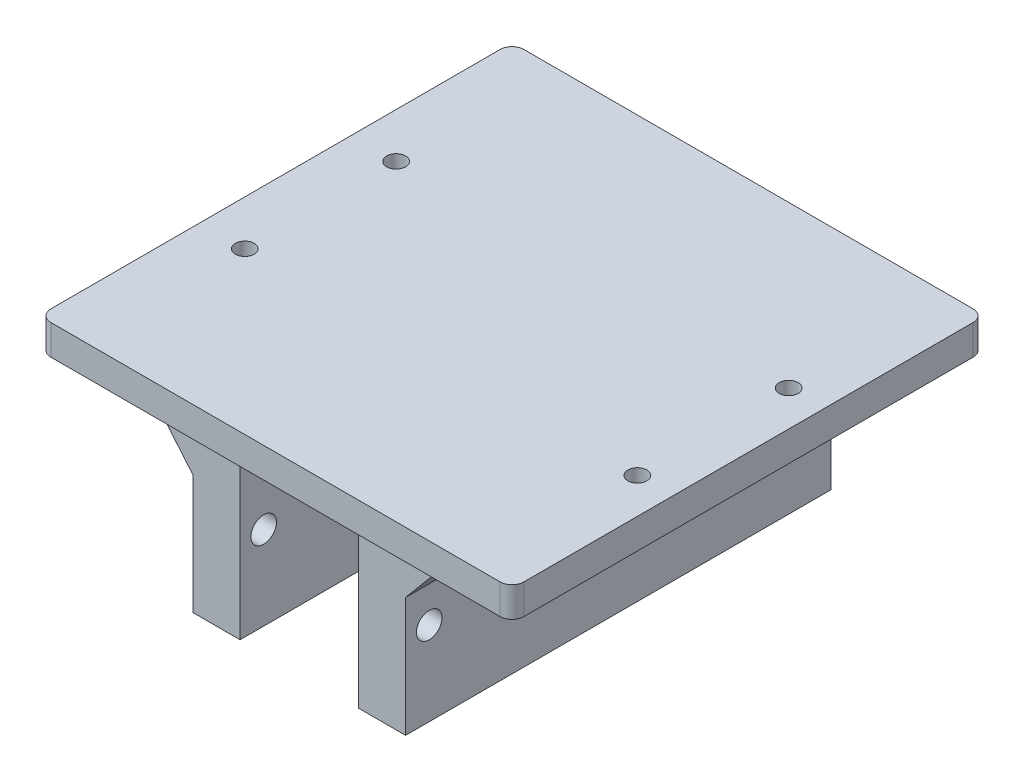
ISO-10303-21;
HEADER;
FILE_DESCRIPTION(('STEP AP214'),'2;1');
FILE_NAME('part.step','',(''),(''),'','','');
FILE_SCHEMA(('AUTOMOTIVE_DESIGN { 1 0 10303 214 1 1 1 1 }'));
ENDSEC;
DATA;
#1=APPLICATION_CONTEXT('core data for automotive mechanical design processes');
#2=APPLICATION_PROTOCOL_DEFINITION('international standard','automotive_design',2000,#1);
#3=PRODUCT_CONTEXT('',#1,'mechanical');
#4=PRODUCT('Part','Part','',(#3));
#5=PRODUCT_RELATED_PRODUCT_CATEGORY('part','',(#4));
#6=PRODUCT_DEFINITION_FORMATION('','',#4);
#7=PRODUCT_DEFINITION_CONTEXT('part definition',#1,'design');
#8=PRODUCT_DEFINITION('design','',#6,#7);
#9=PRODUCT_DEFINITION_SHAPE('','',#8);
#10=(LENGTH_UNIT() NAMED_UNIT(*) SI_UNIT(.MILLI.,.METRE.));
#11=(NAMED_UNIT(*) PLANE_ANGLE_UNIT() SI_UNIT($,.RADIAN.));
#12=(NAMED_UNIT(*) SI_UNIT($,.STERADIAN.) SOLID_ANGLE_UNIT());
#13=UNCERTAINTY_MEASURE_WITH_UNIT(LENGTH_MEASURE(1.E-05),#10,'distance_accuracy_value','');
#14=(GEOMETRIC_REPRESENTATION_CONTEXT(3) GLOBAL_UNCERTAINTY_ASSIGNED_CONTEXT((#13)) GLOBAL_UNIT_ASSIGNED_CONTEXT((#10,
#11,#12)) REPRESENTATION_CONTEXT('',''));
#15=CARTESIAN_POINT('',(0.,0.,0.));
#16=DIRECTION('',(0.,0.,1.));
#17=DIRECTION('',(1.,0.,0.));
#18=AXIS2_PLACEMENT_3D('',#15,#16,#17);
#19=CARTESIAN_POINT('',(72.5,-36.75,-95.));
#20=DIRECTION('',(1.,0.,0.));
#21=DIRECTION('',(0.,0.,-1.));
#22=AXIS2_PLACEMENT_3D('',#19,#20,#21);
#23=PLANE('',#22);
#24=CARTESIAN_POINT('',(72.5,-19.05,-90.));
#25=DIRECTION('',(1.,0.,0.));
#26=DIRECTION('',(0.,0.,-1.));
#27=AXIS2_PLACEMENT_3D('',#24,#25,#26);
#28=CIRCLE('',#27,2.7);
#29=CARTESIAN_POINT('',(72.5,-19.05,-92.7));
#30=VERTEX_POINT('',#29);
#31=EDGE_CURVE('E372',#30,#30,#28,.T.);
#32=ORIENTED_EDGE('',*,*,#31,.F.);
#33=EDGE_LOOP('',(#32));
#34=FACE_BOUND('',#33,.T.);
#35=CARTESIAN_POINT('',(72.5,-19.05,-50.));
#36=DIRECTION('',(1.,0.,0.));
#37=DIRECTION('',(0.,0.,-1.));
#38=AXIS2_PLACEMENT_3D('',#35,#36,#37);
#39=CIRCLE('',#38,2.7);
#40=CARTESIAN_POINT('',(72.5,-19.05,-52.7));
#41=VERTEX_POINT('',#40);
#42=EDGE_CURVE('E351',#41,#41,#39,.T.);
#43=ORIENTED_EDGE('',*,*,#42,.F.);
#44=EDGE_LOOP('',(#43));
#45=FACE_BOUND('',#44,.T.);
#46=CARTESIAN_POINT('',(72.5,-19.05,-10.));
#47=DIRECTION('',(1.,0.,0.));
#48=DIRECTION('',(0.,0.,-1.));
#49=AXIS2_PLACEMENT_3D('',#46,#47,#48);
#50=CIRCLE('',#49,2.7);
#51=CARTESIAN_POINT('',(72.5,-19.05,-12.7));
#52=VERTEX_POINT('',#51);
#53=EDGE_CURVE('E346',#52,#52,#50,.T.);
#54=ORIENTED_EDGE('',*,*,#53,.F.);
#55=EDGE_LOOP('',(#54));
#56=FACE_BOUND('',#55,.T.);
#57=DIRECTION('',(0.,1.,0.));
#58=VECTOR('',#57,1.);
#59=CARTESIAN_POINT('',(72.5,-36.75,-95.));
#60=LINE('',#59,#58);
#61=CARTESIAN_POINT('',(72.5,-36.75,-95.));
#62=VERTEX_POINT('',#61);
#63=CARTESIAN_POINT('',(72.5,-11.4906666467846,-95.));
#64=VERTEX_POINT('',#63);
#65=EDGE_CURVE('E190',#62,#64,#60,.T.);
#66=ORIENTED_EDGE('',*,*,#65,.T.);
#67=DIRECTION('',(0.,0.,1.));
#68=VECTOR('',#67,1.);
#69=CARTESIAN_POINT('',(72.5,-11.4906666467846,-110.));
#70=LINE('',#69,#68);
#71=CARTESIAN_POINT('',(72.5,-11.4906666467846,-5.00000000000002));
#72=VERTEX_POINT('',#71);
#73=EDGE_CURVE('E174',#64,#72,#70,.T.);
#74=ORIENTED_EDGE('',*,*,#73,.T.);
#75=DIRECTION('',(0.,1.,0.));
#76=VECTOR('',#75,1.);
#77=CARTESIAN_POINT('',(72.5,-36.75,-5.00000000000001));
#78=LINE('',#77,#76);
#79=CARTESIAN_POINT('',(72.5,-36.75,-5.00000000000001));
#80=VERTEX_POINT('',#79);
#81=EDGE_CURVE('E201',#80,#72,#78,.T.);
#82=ORIENTED_EDGE('',*,*,#81,.F.);
#83=DIRECTION('',(0.,0.,-1.));
#84=VECTOR('',#83,1.);
#85=CARTESIAN_POINT('',(72.5,-36.75,-95.));
#86=LINE('',#85,#84);
#87=EDGE_CURVE('E198',#80,#62,#86,.T.);
#88=ORIENTED_EDGE('',*,*,#87,.T.);
#89=EDGE_LOOP('',(#66,#74,#82,#88));
#90=FACE_BOUND('',#89,.T.);
#91=ADVANCED_FACE('F45',(#34,#45,#56,#90),#23,.T.);
#92=CARTESIAN_POINT('',(27.5000000000001,-36.75,-5.));
#93=DIRECTION('',(-1.,0.,0.));
#94=DIRECTION('',(0.,0.,1.));
#95=AXIS2_PLACEMENT_3D('',#92,#93,#94);
#96=PLANE('',#95);
#97=CARTESIAN_POINT('',(27.5,-19.05,-90.));
#98=DIRECTION('',(-1.,0.,0.));
#99=DIRECTION('',(0.,0.,1.));
#100=AXIS2_PLACEMENT_3D('',#97,#98,#99);
#101=CIRCLE('',#100,2.7);
#102=CARTESIAN_POINT('',(27.5,-19.05,-87.3));
#103=VERTEX_POINT('',#102);
#104=EDGE_CURVE('E347',#103,#103,#101,.T.);
#105=ORIENTED_EDGE('',*,*,#104,.F.);
#106=EDGE_LOOP('',(#105));
#107=FACE_BOUND('',#106,.T.);
#108=CARTESIAN_POINT('',(27.5,-19.05,-50.));
#109=DIRECTION('',(-1.,0.,0.));
#110=DIRECTION('',(0.,0.,1.));
#111=AXIS2_PLACEMENT_3D('',#108,#109,#110);
#112=CIRCLE('',#111,2.7);
#113=CARTESIAN_POINT('',(27.5,-19.05,-47.3));
#114=VERTEX_POINT('',#113);
#115=EDGE_CURVE('E450',#114,#114,#112,.T.);
#116=ORIENTED_EDGE('',*,*,#115,.F.);
#117=EDGE_LOOP('',(#116));
#118=FACE_BOUND('',#117,.T.);
#119=CARTESIAN_POINT('',(27.5,-19.05,-9.99999999999999));
#120=DIRECTION('',(-1.,0.,0.));
#121=DIRECTION('',(0.,0.,1.));
#122=AXIS2_PLACEMENT_3D('',#119,#120,#121);
#123=CIRCLE('',#122,2.7);
#124=CARTESIAN_POINT('',(27.5,-19.05,-7.29999999999999));
#125=VERTEX_POINT('',#124);
#126=EDGE_CURVE('E195',#125,#125,#123,.T.);
#127=ORIENTED_EDGE('',*,*,#126,.F.);
#128=EDGE_LOOP('',(#127));
#129=FACE_BOUND('',#128,.T.);
#130=DIRECTION('',(0.,1.,0.));
#131=VECTOR('',#130,1.);
#132=CARTESIAN_POINT('',(27.5000000000001,-36.75,-5.));
#133=LINE('',#132,#131);
#134=CARTESIAN_POINT('',(27.5000000000001,-36.75,-5.));
#135=VERTEX_POINT('',#134);
#136=CARTESIAN_POINT('',(27.5000000000001,-11.4906666467846,-5.));
#137=VERTEX_POINT('',#136);
#138=EDGE_CURVE('E395',#135,#137,#133,.T.);
#139=ORIENTED_EDGE('',*,*,#138,.T.);
#140=DIRECTION('',(0.,0.,1.));
#141=VECTOR('',#140,1.);
#142=CARTESIAN_POINT('',(27.5000000000001,-11.4906666467846,-110.));
#143=LINE('',#142,#141);
#144=CARTESIAN_POINT('',(27.5,-11.4906666467846,-95.));
#145=VERTEX_POINT('',#144);
#146=EDGE_CURVE('E428',#145,#137,#143,.T.);
#147=ORIENTED_EDGE('',*,*,#146,.F.);
#148=DIRECTION('',(0.,1.,0.));
#149=VECTOR('',#148,1.);
#150=CARTESIAN_POINT('',(27.5,-36.75,-95.));
#151=LINE('',#150,#149);
#152=CARTESIAN_POINT('',(27.5,-36.75,-95.));
#153=VERTEX_POINT('',#152);
#154=EDGE_CURVE('E242',#153,#145,#151,.T.);
#155=ORIENTED_EDGE('',*,*,#154,.F.);
#156=DIRECTION('',(0.,0.,1.));
#157=VECTOR('',#156,1.);
#158=CARTESIAN_POINT('',(27.5000000000001,-36.75,-5.));
#159=LINE('',#158,#157);
#160=EDGE_CURVE('E379',#153,#135,#159,.T.);
#161=ORIENTED_EDGE('',*,*,#160,.T.);
#162=EDGE_LOOP('',(#139,#147,#155,#161));
#163=FACE_BOUND('',#162,.T.);
#164=ADVANCED_FACE('F459',(#107,#118,#129,#163),#96,.T.);
#165=CARTESIAN_POINT('',(97.5,6.35,-97.5));
#166=DIRECTION('',(0.,-1.,0.));
#167=DIRECTION('',(0.,0.,-1.));
#168=AXIS2_PLACEMENT_3D('',#165,#166,#167);
#169=PLANE('',#168);
#170=CARTESIAN_POINT('',(97.5,6.35,-97.5));
#171=DIRECTION('',(0.,1.,0.));
#172=DIRECTION('',(0.,0.,-1.));
#173=AXIS2_PLACEMENT_3D('',#170,#171,#172);
#174=CIRCLE('',#173,2.5);
#175=CARTESIAN_POINT('',(100.,6.35,-97.5));
#176=VERTEX_POINT('',#175);
#177=CARTESIAN_POINT('',(97.5,6.35,-100.));
#178=VERTEX_POINT('',#177);
#179=EDGE_CURVE('E267',#176,#178,#174,.T.);
#180=ORIENTED_EDGE('',*,*,#179,.T.);
#181=DIRECTION('',(-1.,0.,0.));
#182=VECTOR('',#181,1.);
#183=CARTESIAN_POINT('',(2.5,6.35,-100.));
#184=LINE('',#183,#182);
#185=CARTESIAN_POINT('',(2.5,6.35,-100.));
#186=VERTEX_POINT('',#185);
#187=EDGE_CURVE('E271',#178,#186,#184,.T.);
#188=ORIENTED_EDGE('',*,*,#187,.T.);
#189=CARTESIAN_POINT('',(2.5,6.35,-97.5));
#190=DIRECTION('',(0.,1.,0.));
#191=DIRECTION('',(0.,0.,-1.));
#192=AXIS2_PLACEMENT_3D('',#189,#190,#191);
#193=CIRCLE('',#192,2.5);
#194=CARTESIAN_POINT('',(0.,6.35,-97.5));
#195=VERTEX_POINT('',#194);
#196=EDGE_CURVE('E275',#186,#195,#193,.T.);
#197=ORIENTED_EDGE('',*,*,#196,.T.);
#198=DIRECTION('',(0.,0.,1.));
#199=VECTOR('',#198,1.);
#200=CARTESIAN_POINT('',(0.,6.35,-2.50000000000002));
#201=LINE('',#200,#199);
#202=CARTESIAN_POINT('',(0.,6.35,-2.50000000000002));
#203=VERTEX_POINT('',#202);
#204=EDGE_CURVE('E278',#195,#203,#201,.T.);
#205=ORIENTED_EDGE('',*,*,#204,.T.);
#206=CARTESIAN_POINT('',(2.5,6.35,-2.5));
#207=DIRECTION('',(0.,1.,0.));
#208=DIRECTION('',(0.,0.,-1.));
#209=AXIS2_PLACEMENT_3D('',#206,#207,#208);
#210=CIRCLE('',#209,2.5);
#211=CARTESIAN_POINT('',(2.50000000000002,6.35,0.));
#212=VERTEX_POINT('',#211);
#213=EDGE_CURVE('E281',#203,#212,#210,.T.);
#214=ORIENTED_EDGE('',*,*,#213,.T.);
#215=DIRECTION('',(1.,0.,0.));
#216=VECTOR('',#215,1.);
#217=CARTESIAN_POINT('',(2.50000000000002,6.35,0.));
#218=LINE('',#217,#216);
#219=CARTESIAN_POINT('',(97.5,6.35,0.));
#220=VERTEX_POINT('',#219);
#221=EDGE_CURVE('E284',#212,#220,#218,.T.);
#222=ORIENTED_EDGE('',*,*,#221,.T.);
#223=CARTESIAN_POINT('',(97.5,6.35,-2.5));
#224=DIRECTION('',(0.,1.,0.));
#225=DIRECTION('',(0.,0.,1.));
#226=AXIS2_PLACEMENT_3D('',#223,#224,#225);
#227=CIRCLE('',#226,2.5);
#228=CARTESIAN_POINT('',(100.,6.35,-2.5));
#229=VERTEX_POINT('',#228);
#230=EDGE_CURVE('E287',#220,#229,#227,.T.);
#231=ORIENTED_EDGE('',*,*,#230,.T.);
#232=DIRECTION('',(0.,0.,-1.));
#233=VECTOR('',#232,1.);
#234=CARTESIAN_POINT('',(100.,6.35,-2.5));
#235=LINE('',#234,#233);
#236=EDGE_CURVE('E290',#229,#176,#235,.T.);
#237=ORIENTED_EDGE('',*,*,#236,.T.);
#238=EDGE_LOOP('',(#180,#188,#197,#205,#214,#222,#231,#237));
#239=FACE_BOUND('',#238,.T.);
#240=CARTESIAN_POINT('',(9.5,6.35,-34.));
#241=DIRECTION('',(0.,1.,0.));
#242=DIRECTION('',(0.,0.,1.));
#243=AXIS2_PLACEMENT_3D('',#240,#241,#242);
#244=CIRCLE('',#243,2.);
#245=CARTESIAN_POINT('',(9.5,6.35,-32.));
#246=VERTEX_POINT('',#245);
#247=EDGE_CURVE('E259',#246,#246,#244,.T.);
#248=ORIENTED_EDGE('',*,*,#247,.F.);
#249=EDGE_LOOP('',(#248));
#250=FACE_BOUND('',#249,.T.);
#251=CARTESIAN_POINT('',(9.5,6.35,-66.));
#252=DIRECTION('',(0.,1.,0.));
#253=DIRECTION('',(0.,0.,1.));
#254=AXIS2_PLACEMENT_3D('',#251,#252,#253);
#255=CIRCLE('',#254,2.);
#256=CARTESIAN_POINT('',(9.5,6.35,-64.));
#257=VERTEX_POINT('',#256);
#258=EDGE_CURVE('E251',#257,#257,#255,.T.);
#259=ORIENTED_EDGE('',*,*,#258,.F.);
#260=EDGE_LOOP('',(#259));
#261=FACE_BOUND('',#260,.T.);
#262=CARTESIAN_POINT('',(92.5,6.35,-66.));
#263=DIRECTION('',(0.,1.,0.));
#264=DIRECTION('',(0.,0.,1.));
#265=AXIS2_PLACEMENT_3D('',#262,#263,#264);
#266=CIRCLE('',#265,2.);
#267=CARTESIAN_POINT('',(92.5,6.35,-64.));
#268=VERTEX_POINT('',#267);
#269=EDGE_CURVE('E243',#268,#268,#266,.T.);
#270=ORIENTED_EDGE('',*,*,#269,.F.);
#271=EDGE_LOOP('',(#270));
#272=FACE_BOUND('',#271,.T.);
#273=CARTESIAN_POINT('',(92.5,6.35,-34.));
#274=DIRECTION('',(0.,1.,0.));
#275=DIRECTION('',(0.,0.,1.));
#276=AXIS2_PLACEMENT_3D('',#273,#274,#275);
#277=CIRCLE('',#276,2.);
#278=CARTESIAN_POINT('',(92.5,6.35,-32.));
#279=VERTEX_POINT('',#278);
#280=EDGE_CURVE('E233',#279,#279,#277,.T.);
#281=ORIENTED_EDGE('',*,*,#280,.F.);
#282=EDGE_LOOP('',(#281));
#283=FACE_BOUND('',#282,.T.);
#284=ADVANCED_FACE('F462',(#239,#250,#261,#272,#283),#169,.F.);
#285=CARTESIAN_POINT('',(97.5,0.,-97.5));
#286=DIRECTION('',(0.,-1.,0.));
#287=DIRECTION('',(0.,0.,-1.));
#288=AXIS2_PLACEMENT_3D('',#285,#286,#287);
#289=PLANE('',#288);
#290=DIRECTION('',(1.,0.,0.));
#291=VECTOR('',#290,1.);
#292=CARTESIAN_POINT('',(62.5,0.,-5.00000000000001));
#293=LINE('',#292,#291);
#294=CARTESIAN_POINT('',(62.5,0.,-5.00000000000001));
#295=VERTEX_POINT('',#294);
#296=CARTESIAN_POINT('',(82.1418141452982,0.,-5.00000000000002));
#297=VERTEX_POINT('',#296);
#298=EDGE_CURVE('E214',#295,#297,#293,.T.);
#299=ORIENTED_EDGE('',*,*,#298,.T.);
#300=DIRECTION('',(0.,0.,1.));
#301=VECTOR('',#300,1.);
#302=CARTESIAN_POINT('',(82.1418141452982,0.,-110.));
#303=LINE('',#302,#301);
#304=CARTESIAN_POINT('',(82.1418141452982,0.,-95.));
#305=VERTEX_POINT('',#304);
#306=EDGE_CURVE('E426',#305,#297,#303,.T.);
#307=ORIENTED_EDGE('',*,*,#306,.F.);
#308=DIRECTION('',(-1.,0.,0.));
#309=VECTOR('',#308,1.);
#310=CARTESIAN_POINT('',(62.5,0.,-95.));
#311=LINE('',#310,#309);
#312=CARTESIAN_POINT('',(62.5,0.,-95.));
#313=VERTEX_POINT('',#312);
#314=EDGE_CURVE('E193',#305,#313,#311,.T.);
#315=ORIENTED_EDGE('',*,*,#314,.T.);
#316=DIRECTION('',(0.,0.,1.));
#317=VECTOR('',#316,1.);
#318=CARTESIAN_POINT('',(62.5,0.,-95.));
#319=LINE('',#318,#317);
#320=EDGE_CURVE('E218',#313,#295,#319,.T.);
#321=ORIENTED_EDGE('',*,*,#320,.T.);
#322=EDGE_LOOP('',(#299,#307,#315,#321));
#323=FACE_BOUND('',#322,.T.);
#324=DIRECTION('',(0.,0.,1.));
#325=VECTOR('',#324,1.);
#326=CARTESIAN_POINT('',(17.8581858547019,0.,-110.));
#327=LINE('',#326,#325);
#328=CARTESIAN_POINT('',(17.8581858547019,0.,-95.));
#329=VERTEX_POINT('',#328);
#330=CARTESIAN_POINT('',(17.8581858547019,0.,-5.));
#331=VERTEX_POINT('',#330);
#332=EDGE_CURVE('E437',#329,#331,#327,.T.);
#333=ORIENTED_EDGE('',*,*,#332,.T.);
#334=DIRECTION('',(1.,0.,0.));
#335=VECTOR('',#334,1.);
#336=CARTESIAN_POINT('',(27.5000000000001,0.,-5.));
#337=LINE('',#336,#335);
#338=CARTESIAN_POINT('',(37.5,0.,-5.00000000000001));
#339=VERTEX_POINT('',#338);
#340=EDGE_CURVE('E63',#331,#339,#337,.T.);
#341=ORIENTED_EDGE('',*,*,#340,.T.);
#342=DIRECTION('',(0.,0.,-1.));
#343=VECTOR('',#342,1.);
#344=CARTESIAN_POINT('',(37.5,0.,-5.00000000000001));
#345=LINE('',#344,#343);
#346=CARTESIAN_POINT('',(37.5,0.,-95.));
#347=VERTEX_POINT('',#346);
#348=EDGE_CURVE('E398',#339,#347,#345,.T.);
#349=ORIENTED_EDGE('',*,*,#348,.T.);
#350=DIRECTION('',(-1.,0.,0.));
#351=VECTOR('',#350,1.);
#352=CARTESIAN_POINT('',(27.5,0.,-95.));
#353=LINE('',#352,#351);
#354=EDGE_CURVE('E70',#347,#329,#353,.T.);
#355=ORIENTED_EDGE('',*,*,#354,.T.);
#356=EDGE_LOOP('',(#333,#341,#349,#355));
#357=FACE_BOUND('',#356,.T.);
#358=CARTESIAN_POINT('',(92.5,0.,-66.));
#359=DIRECTION('',(0.,1.,0.));
#360=DIRECTION('',(0.,0.,1.));
#361=AXIS2_PLACEMENT_3D('',#358,#359,#360);
#362=CIRCLE('',#361,2.);
#363=CARTESIAN_POINT('',(92.5,0.,-64.));
#364=VERTEX_POINT('',#363);
#365=EDGE_CURVE('E237',#364,#364,#362,.T.);
#366=ORIENTED_EDGE('',*,*,#365,.T.);
#367=EDGE_LOOP('',(#366));
#368=FACE_BOUND('',#367,.T.);
#369=CARTESIAN_POINT('',(9.5,0.,-34.));
#370=DIRECTION('',(0.,1.,0.));
#371=DIRECTION('',(0.,0.,1.));
#372=AXIS2_PLACEMENT_3D('',#369,#370,#371);
#373=CIRCLE('',#372,2.);
#374=CARTESIAN_POINT('',(9.5,0.,-32.));
#375=VERTEX_POINT('',#374);
#376=EDGE_CURVE('E255',#375,#375,#373,.T.);
#377=ORIENTED_EDGE('',*,*,#376,.T.);
#378=EDGE_LOOP('',(#377));
#379=FACE_BOUND('',#378,.T.);
#380=CARTESIAN_POINT('',(97.5,0.,-97.5));
#381=DIRECTION('',(0.,1.,0.));
#382=DIRECTION('',(0.,0.,-1.));
#383=AXIS2_PLACEMENT_3D('',#380,#381,#382);
#384=CIRCLE('',#383,2.5);
#385=CARTESIAN_POINT('',(100.,0.,-97.5));
#386=VERTEX_POINT('',#385);
#387=CARTESIAN_POINT('',(97.5,0.,-100.));
#388=VERTEX_POINT('',#387);
#389=EDGE_CURVE('E263',#386,#388,#384,.T.);
#390=ORIENTED_EDGE('',*,*,#389,.F.);
#391=DIRECTION('',(0.,0.,-1.));
#392=VECTOR('',#391,1.);
#393=CARTESIAN_POINT('',(100.,0.,-2.5));
#394=LINE('',#393,#392);
#395=CARTESIAN_POINT('',(100.,0.,-2.5));
#396=VERTEX_POINT('',#395);
#397=EDGE_CURVE('E272',#396,#386,#394,.T.);
#398=ORIENTED_EDGE('',*,*,#397,.F.);
#399=CARTESIAN_POINT('',(97.5,0.,-2.5));
#400=DIRECTION('',(0.,1.,0.));
#401=DIRECTION('',(0.,0.,1.));
#402=AXIS2_PLACEMENT_3D('',#399,#400,#401);
#403=CIRCLE('',#402,2.5);
#404=CARTESIAN_POINT('',(97.5,0.,0.));
#405=VERTEX_POINT('',#404);
#406=EDGE_CURVE('E312',#405,#396,#403,.T.);
#407=ORIENTED_EDGE('',*,*,#406,.F.);
#408=DIRECTION('',(1.,0.,0.));
#409=VECTOR('',#408,1.);
#410=CARTESIAN_POINT('',(2.50000000000002,0.,0.));
#411=LINE('',#410,#409);
#412=CARTESIAN_POINT('',(2.50000000000002,0.,0.));
#413=VERTEX_POINT('',#412);
#414=EDGE_CURVE('E309',#413,#405,#411,.T.);
#415=ORIENTED_EDGE('',*,*,#414,.F.);
#416=CARTESIAN_POINT('',(2.5,0.,-2.5));
#417=DIRECTION('',(0.,1.,0.));
#418=DIRECTION('',(0.,0.,-1.));
#419=AXIS2_PLACEMENT_3D('',#416,#417,#418);
#420=CIRCLE('',#419,2.5);
#421=CARTESIAN_POINT('',(0.,0.,-2.50000000000002));
#422=VERTEX_POINT('',#421);
#423=EDGE_CURVE('E306',#422,#413,#420,.T.);
#424=ORIENTED_EDGE('',*,*,#423,.F.);
#425=DIRECTION('',(0.,0.,1.));
#426=VECTOR('',#425,1.);
#427=CARTESIAN_POINT('',(0.,0.,-2.50000000000002));
#428=LINE('',#427,#426);
#429=CARTESIAN_POINT('',(0.,0.,-97.5));
#430=VERTEX_POINT('',#429);
#431=EDGE_CURVE('E303',#430,#422,#428,.T.);
#432=ORIENTED_EDGE('',*,*,#431,.F.);
#433=CARTESIAN_POINT('',(2.5,0.,-97.5));
#434=DIRECTION('',(0.,1.,0.));
#435=DIRECTION('',(0.,0.,-1.));
#436=AXIS2_PLACEMENT_3D('',#433,#434,#435);
#437=CIRCLE('',#436,2.5);
#438=CARTESIAN_POINT('',(2.5,0.,-100.));
#439=VERTEX_POINT('',#438);
#440=EDGE_CURVE('E300',#439,#430,#437,.T.);
#441=ORIENTED_EDGE('',*,*,#440,.F.);
#442=DIRECTION('',(-1.,0.,0.));
#443=VECTOR('',#442,1.);
#444=CARTESIAN_POINT('',(2.5,0.,-100.));
#445=LINE('',#444,#443);
#446=EDGE_CURVE('E297',#388,#439,#445,.T.);
#447=ORIENTED_EDGE('',*,*,#446,.F.);
#448=EDGE_LOOP('',(#390,#398,#407,#415,#424,#432,#441,#447));
#449=FACE_BOUND('',#448,.T.);
#450=CARTESIAN_POINT('',(9.5,0.,-66.));
#451=DIRECTION('',(0.,1.,0.));
#452=DIRECTION('',(0.,0.,1.));
#453=AXIS2_PLACEMENT_3D('',#450,#451,#452);
#454=CIRCLE('',#453,2.);
#455=CARTESIAN_POINT('',(9.5,0.,-64.));
#456=VERTEX_POINT('',#455);
#457=EDGE_CURVE('E247',#456,#456,#454,.T.);
#458=ORIENTED_EDGE('',*,*,#457,.T.);
#459=EDGE_LOOP('',(#458));
#460=FACE_BOUND('',#459,.T.);
#461=CARTESIAN_POINT('',(92.5,0.,-34.));
#462=DIRECTION('',(0.,1.,0.));
#463=DIRECTION('',(0.,0.,1.));
#464=AXIS2_PLACEMENT_3D('',#461,#462,#463);
#465=CIRCLE('',#464,2.);
#466=CARTESIAN_POINT('',(92.5,0.,-32.));
#467=VERTEX_POINT('',#466);
#468=EDGE_CURVE('E238',#467,#467,#465,.T.);
#469=ORIENTED_EDGE('',*,*,#468,.T.);
#470=EDGE_LOOP('',(#469));
#471=FACE_BOUND('',#470,.T.);
#472=ADVANCED_FACE('F425',(#323,#357,#368,#379,#449,#460,#471),#289,.T.);
#473=CARTESIAN_POINT('',(97.5,6.35,-97.5));
#474=DIRECTION('',(0.,-1.,0.));
#475=DIRECTION('',(0.,0.,-1.));
#476=AXIS2_PLACEMENT_3D('',#473,#474,#475);
#477=CYLINDRICAL_SURFACE('',#476,2.5);
#478=ORIENTED_EDGE('',*,*,#389,.T.);
#479=DIRECTION('',(0.,-1.,0.));
#480=VECTOR('',#479,1.);
#481=CARTESIAN_POINT('',(97.5,6.35,-100.));
#482=LINE('',#481,#480);
#483=EDGE_CURVE('E11',#178,#388,#482,.T.);
#484=ORIENTED_EDGE('',*,*,#483,.F.);
#485=ORIENTED_EDGE('',*,*,#179,.F.);
#486=DIRECTION('',(0.,-1.,0.));
#487=VECTOR('',#486,1.);
#488=CARTESIAN_POINT('',(100.,6.35,-97.5));
#489=LINE('',#488,#487);
#490=EDGE_CURVE('E293',#176,#386,#489,.T.);
#491=ORIENTED_EDGE('',*,*,#490,.T.);
#492=EDGE_LOOP('',(#478,#484,#485,#491));
#493=FACE_BOUND('',#492,.T.);
#494=ADVANCED_FACE('F47',(#493),#477,.T.);
#495=CARTESIAN_POINT('',(2.5,6.35,-100.));
#496=DIRECTION('',(0.,0.,1.));
#497=DIRECTION('',(1.,0.,0.));
#498=AXIS2_PLACEMENT_3D('',#495,#496,#497);
#499=PLANE('',#498);
#500=ORIENTED_EDGE('',*,*,#446,.T.);
#501=DIRECTION('',(0.,-1.,0.));
#502=VECTOR('',#501,1.);
#503=CARTESIAN_POINT('',(2.5,6.35,-100.));
#504=LINE('',#503,#502);
#505=EDGE_CURVE('E55',#186,#439,#504,.T.);
#506=ORIENTED_EDGE('',*,*,#505,.F.);
#507=ORIENTED_EDGE('',*,*,#187,.F.);
#508=ORIENTED_EDGE('',*,*,#483,.T.);
#509=EDGE_LOOP('',(#500,#506,#507,#508));
#510=FACE_BOUND('',#509,.T.);
#511=ADVANCED_FACE('F546',(#510),#499,.F.);
#512=CARTESIAN_POINT('',(2.5,6.35,-97.5));
#513=DIRECTION('',(0.,-1.,0.));
#514=DIRECTION('',(0.,0.,-1.));
#515=AXIS2_PLACEMENT_3D('',#512,#513,#514);
#516=CYLINDRICAL_SURFACE('',#515,2.5);
#517=ORIENTED_EDGE('',*,*,#440,.T.);
#518=DIRECTION('',(0.,-1.,0.));
#519=VECTOR('',#518,1.);
#520=CARTESIAN_POINT('',(0.,6.35,-97.5));
#521=LINE('',#520,#519);
#522=EDGE_CURVE('E336',#195,#430,#521,.T.);
#523=ORIENTED_EDGE('',*,*,#522,.F.);
#524=ORIENTED_EDGE('',*,*,#196,.F.);
#525=ORIENTED_EDGE('',*,*,#505,.T.);
#526=EDGE_LOOP('',(#517,#523,#524,#525));
#527=FACE_BOUND('',#526,.T.);
#528=ADVANCED_FACE('F543',(#527),#516,.T.);
#529=CARTESIAN_POINT('',(0.,6.35,-2.50000000000002));
#530=DIRECTION('',(1.,0.,0.));
#531=DIRECTION('',(0.,0.,-1.));
#532=AXIS2_PLACEMENT_3D('',#529,#530,#531);
#533=PLANE('',#532);
#534=ORIENTED_EDGE('',*,*,#431,.T.);
#535=DIRECTION('',(0.,-1.,0.));
#536=VECTOR('',#535,1.);
#537=CARTESIAN_POINT('',(0.,6.35,-2.50000000000002));
#538=LINE('',#537,#536);
#539=EDGE_CURVE('E332',#203,#422,#538,.T.);
#540=ORIENTED_EDGE('',*,*,#539,.F.);
#541=ORIENTED_EDGE('',*,*,#204,.F.);
#542=ORIENTED_EDGE('',*,*,#522,.T.);
#543=EDGE_LOOP('',(#534,#540,#541,#542));
#544=FACE_BOUND('',#543,.T.);
#545=ADVANCED_FACE('F539',(#544),#533,.F.);
#546=CARTESIAN_POINT('',(2.5,6.35,-2.5));
#547=DIRECTION('',(0.,-1.,0.));
#548=DIRECTION('',(0.,0.,-1.));
#549=AXIS2_PLACEMENT_3D('',#546,#547,#548);
#550=CYLINDRICAL_SURFACE('',#549,2.5);
#551=ORIENTED_EDGE('',*,*,#423,.T.);
#552=DIRECTION('',(0.,-1.,0.));
#553=VECTOR('',#552,1.);
#554=CARTESIAN_POINT('',(2.50000000000002,6.35,0.));
#555=LINE('',#554,#553);
#556=EDGE_CURVE('E328',#212,#413,#555,.T.);
#557=ORIENTED_EDGE('',*,*,#556,.F.);
#558=ORIENTED_EDGE('',*,*,#213,.F.);
#559=ORIENTED_EDGE('',*,*,#539,.T.);
#560=EDGE_LOOP('',(#551,#557,#558,#559));
#561=FACE_BOUND('',#560,.T.);
#562=ADVANCED_FACE('F535',(#561),#550,.T.);
#563=CARTESIAN_POINT('',(2.50000000000002,6.35,0.));
#564=DIRECTION('',(0.,0.,-1.));
#565=DIRECTION('',(-1.,0.,0.));
#566=AXIS2_PLACEMENT_3D('',#563,#564,#565);
#567=PLANE('',#566);
#568=ORIENTED_EDGE('',*,*,#414,.T.);
#569=DIRECTION('',(0.,-1.,0.));
#570=VECTOR('',#569,1.);
#571=CARTESIAN_POINT('',(97.5,6.35,0.));
#572=LINE('',#571,#570);
#573=EDGE_CURVE('E324',#220,#405,#572,.T.);
#574=ORIENTED_EDGE('',*,*,#573,.F.);
#575=ORIENTED_EDGE('',*,*,#221,.F.);
#576=ORIENTED_EDGE('',*,*,#556,.T.);
#577=EDGE_LOOP('',(#568,#574,#575,#576));
#578=FACE_BOUND('',#577,.T.);
#579=ADVANCED_FACE('F531',(#578),#567,.F.);
#580=CARTESIAN_POINT('',(97.5,6.35,-2.5));
#581=DIRECTION('',(0.,-1.,0.));
#582=DIRECTION('',(0.,0.,-1.));
#583=AXIS2_PLACEMENT_3D('',#580,#581,#582);
#584=CYLINDRICAL_SURFACE('',#583,2.5);
#585=ORIENTED_EDGE('',*,*,#406,.T.);
#586=DIRECTION('',(0.,-1.,0.));
#587=VECTOR('',#586,1.);
#588=CARTESIAN_POINT('',(100.,6.35,-2.5));
#589=LINE('',#588,#587);
#590=EDGE_CURVE('E320',#229,#396,#589,.T.);
#591=ORIENTED_EDGE('',*,*,#590,.F.);
#592=ORIENTED_EDGE('',*,*,#230,.F.);
#593=ORIENTED_EDGE('',*,*,#573,.T.);
#594=EDGE_LOOP('',(#585,#591,#592,#593));
#595=FACE_BOUND('',#594,.T.);
#596=ADVANCED_FACE('F527',(#595),#584,.T.);
#597=CARTESIAN_POINT('',(100.,6.35,-2.5));
#598=DIRECTION('',(-1.,0.,0.));
#599=DIRECTION('',(0.,0.,1.));
#600=AXIS2_PLACEMENT_3D('',#597,#598,#599);
#601=PLANE('',#600);
#602=ORIENTED_EDGE('',*,*,#397,.T.);
#603=ORIENTED_EDGE('',*,*,#490,.F.);
#604=ORIENTED_EDGE('',*,*,#236,.F.);
#605=ORIENTED_EDGE('',*,*,#590,.T.);
#606=EDGE_LOOP('',(#602,#603,#604,#605));
#607=FACE_BOUND('',#606,.T.);
#608=ADVANCED_FACE('F518',(#607),#601,.F.);
#609=CARTESIAN_POINT('',(9.5,6.35,-34.));
#610=DIRECTION('',(0.,-1.,0.));
#611=DIRECTION('',(0.,0.,-1.));
#612=AXIS2_PLACEMENT_3D('',#609,#610,#611);
#613=CYLINDRICAL_SURFACE('',#612,2.);
#614=ORIENTED_EDGE('',*,*,#247,.T.);
#615=EDGE_LOOP('',(#614));
#616=FACE_BOUND('',#615,.T.);
#617=ORIENTED_EDGE('',*,*,#376,.F.);
#618=EDGE_LOOP('',(#617));
#619=FACE_BOUND('',#618,.T.);
#620=ADVANCED_FACE('F514',(#616,#619),#613,.F.);
#621=CARTESIAN_POINT('',(9.5,6.35,-66.));
#622=DIRECTION('',(0.,-1.,0.));
#623=DIRECTION('',(0.,0.,-1.));
#624=AXIS2_PLACEMENT_3D('',#621,#622,#623);
#625=CYLINDRICAL_SURFACE('',#624,2.);
#626=ORIENTED_EDGE('',*,*,#258,.T.);
#627=EDGE_LOOP('',(#626));
#628=FACE_BOUND('',#627,.T.);
#629=ORIENTED_EDGE('',*,*,#457,.F.);
#630=EDGE_LOOP('',(#629));
#631=FACE_BOUND('',#630,.T.);
#632=ADVANCED_FACE('F510',(#628,#631),#625,.F.);
#633=CARTESIAN_POINT('',(92.5,6.35,-66.));
#634=DIRECTION('',(0.,-1.,0.));
#635=DIRECTION('',(0.,0.,-1.));
#636=AXIS2_PLACEMENT_3D('',#633,#634,#635);
#637=CYLINDRICAL_SURFACE('',#636,2.);
#638=ORIENTED_EDGE('',*,*,#269,.T.);
#639=EDGE_LOOP('',(#638));
#640=FACE_BOUND('',#639,.T.);
#641=ORIENTED_EDGE('',*,*,#365,.F.);
#642=EDGE_LOOP('',(#641));
#643=FACE_BOUND('',#642,.T.);
#644=ADVANCED_FACE('F506',(#640,#643),#637,.F.);
#645=CARTESIAN_POINT('',(92.5,6.35,-34.));
#646=DIRECTION('',(0.,-1.,0.));
#647=DIRECTION('',(0.,0.,-1.));
#648=AXIS2_PLACEMENT_3D('',#645,#646,#647);
#649=CYLINDRICAL_SURFACE('',#648,2.);
#650=ORIENTED_EDGE('',*,*,#280,.T.);
#651=EDGE_LOOP('',(#650));
#652=FACE_BOUND('',#651,.T.);
#653=ORIENTED_EDGE('',*,*,#468,.F.);
#654=EDGE_LOOP('',(#653));
#655=FACE_BOUND('',#654,.T.);
#656=ADVANCED_FACE('F503',(#652,#655),#649,.F.);
#657=CARTESIAN_POINT('',(62.5,-36.75,-95.));
#658=DIRECTION('',(-1.,0.,0.));
#659=DIRECTION('',(0.,0.,1.));
#660=AXIS2_PLACEMENT_3D('',#657,#658,#659);
#661=PLANE('',#660);
#662=CARTESIAN_POINT('',(62.5,-19.05,-90.));
#663=DIRECTION('',(-1.,0.,0.));
#664=DIRECTION('',(0.,0.,1.));
#665=AXIS2_PLACEMENT_3D('',#662,#663,#664);
#666=CIRCLE('',#665,2.7);
#667=CARTESIAN_POINT('',(62.5,-19.05,-87.3));
#668=VERTEX_POINT('',#667);
#669=EDGE_CURVE('E208',#668,#668,#666,.T.);
#670=ORIENTED_EDGE('',*,*,#669,.F.);
#671=EDGE_LOOP('',(#670));
#672=FACE_BOUND('',#671,.T.);
#673=CARTESIAN_POINT('',(62.5,-19.05,-50.));
#674=DIRECTION('',(-1.,0.,0.));
#675=DIRECTION('',(0.,0.,1.));
#676=AXIS2_PLACEMENT_3D('',#673,#674,#675);
#677=CIRCLE('',#676,2.7);
#678=CARTESIAN_POINT('',(62.5,-19.05,-47.3));
#679=VERTEX_POINT('',#678);
#680=EDGE_CURVE('E358',#679,#679,#677,.T.);
#681=ORIENTED_EDGE('',*,*,#680,.F.);
#682=EDGE_LOOP('',(#681));
#683=FACE_BOUND('',#682,.T.);
#684=CARTESIAN_POINT('',(62.5,-19.05,-10.));
#685=DIRECTION('',(-1.,0.,0.));
#686=DIRECTION('',(0.,0.,1.));
#687=AXIS2_PLACEMENT_3D('',#684,#685,#686);
#688=CIRCLE('',#687,2.7);
#689=CARTESIAN_POINT('',(62.5,-19.05,-7.3));
#690=VERTEX_POINT('',#689);
#691=EDGE_CURVE('E352',#690,#690,#688,.T.);
#692=ORIENTED_EDGE('',*,*,#691,.F.);
#693=EDGE_LOOP('',(#692));
#694=FACE_BOUND('',#693,.T.);
#695=ORIENTED_EDGE('',*,*,#320,.F.);
#696=DIRECTION('',(0.,1.,0.));
#697=VECTOR('',#696,1.);
#698=CARTESIAN_POINT('',(62.5,-36.75,-95.));
#699=LINE('',#698,#697);
#700=CARTESIAN_POINT('',(62.5,-36.75,-95.));
#701=VERTEX_POINT('',#700);
#702=EDGE_CURVE('E202',#701,#313,#699,.T.);
#703=ORIENTED_EDGE('',*,*,#702,.F.);
#704=DIRECTION('',(0.,0.,1.));
#705=VECTOR('',#704,1.);
#706=CARTESIAN_POINT('',(62.5,-36.75,-95.));
#707=LINE('',#706,#705);
#708=CARTESIAN_POINT('',(62.5,-36.75,-5.00000000000001));
#709=VERTEX_POINT('',#708);
#710=EDGE_CURVE('E215',#701,#709,#707,.T.);
#711=ORIENTED_EDGE('',*,*,#710,.T.);
#712=DIRECTION('',(0.,1.,0.));
#713=VECTOR('',#712,1.);
#714=CARTESIAN_POINT('',(62.5,-36.75,-5.00000000000001));
#715=LINE('',#714,#713);
#716=EDGE_CURVE('E206',#709,#295,#715,.T.);
#717=ORIENTED_EDGE('',*,*,#716,.T.);
#718=EDGE_LOOP('',(#695,#703,#711,#717));
#719=FACE_BOUND('',#718,.T.);
#720=ADVANCED_FACE('F419',(#672,#683,#694,#719),#661,.T.);
#721=CARTESIAN_POINT('',(62.5,-36.75,-95.));
#722=DIRECTION('',(0.,0.,-1.));
#723=DIRECTION('',(-1.,0.,0.));
#724=AXIS2_PLACEMENT_3D('',#721,#722,#723);
#725=PLANE('',#724);
#726=ORIENTED_EDGE('',*,*,#314,.F.);
#727=DIRECTION('',(-0.642787609686544,-0.766044443118975,0.));
#728=VECTOR('',#727,1.);
#729=CARTESIAN_POINT('',(41.4692903364225,-48.4716263691005,-95.));
#730=LINE('',#729,#728);
#731=EDGE_CURVE('E178',#305,#64,#730,.T.);
#732=ORIENTED_EDGE('',*,*,#731,.T.);
#733=ORIENTED_EDGE('',*,*,#65,.F.);
#734=DIRECTION('',(-1.,0.,0.));
#735=VECTOR('',#734,1.);
#736=CARTESIAN_POINT('',(62.5,-36.75,-95.));
#737=LINE('',#736,#735);
#738=EDGE_CURVE('E221',#62,#701,#737,.T.);
#739=ORIENTED_EDGE('',*,*,#738,.T.);
#740=ORIENTED_EDGE('',*,*,#702,.T.);
#741=EDGE_LOOP('',(#726,#732,#733,#739,#740));
#742=FACE_BOUND('',#741,.T.);
#743=ADVANCED_FACE('F188',(#742),#725,.T.);
#744=CARTESIAN_POINT('',(62.5,-36.75,-5.00000000000001));
#745=DIRECTION('',(0.,0.,1.));
#746=DIRECTION('',(1.,0.,0.));
#747=AXIS2_PLACEMENT_3D('',#744,#745,#746);
#748=PLANE('',#747);
#749=ORIENTED_EDGE('',*,*,#298,.F.);
#750=ORIENTED_EDGE('',*,*,#716,.F.);
#751=DIRECTION('',(1.,0.,0.));
#752=VECTOR('',#751,1.);
#753=CARTESIAN_POINT('',(62.5,-36.75,-5.00000000000001));
#754=LINE('',#753,#752);
#755=EDGE_CURVE('E226',#709,#80,#754,.T.);
#756=ORIENTED_EDGE('',*,*,#755,.T.);
#757=ORIENTED_EDGE('',*,*,#81,.T.);
#758=DIRECTION('',(-0.642787609686544,-0.766044443118975,0.));
#759=VECTOR('',#758,1.);
#760=CARTESIAN_POINT('',(41.4692903364225,-48.4716263691005,-5.00000000000001));
#761=LINE('',#760,#759);
#762=EDGE_CURVE('E181',#297,#72,#761,.T.);
#763=ORIENTED_EDGE('',*,*,#762,.F.);
#764=EDGE_LOOP('',(#749,#750,#756,#757,#763));
#765=FACE_BOUND('',#764,.T.);
#766=ADVANCED_FACE('F423',(#765),#748,.T.);
#767=CARTESIAN_POINT('',(0.,-36.75,0.));
#768=DIRECTION('',(0.,1.,0.));
#769=DIRECTION('',(0.,0.,1.));
#770=AXIS2_PLACEMENT_3D('',#767,#768,#769);
#771=PLANE('',#770);
#772=ORIENTED_EDGE('',*,*,#710,.F.);
#773=ORIENTED_EDGE('',*,*,#738,.F.);
#774=ORIENTED_EDGE('',*,*,#87,.F.);
#775=ORIENTED_EDGE('',*,*,#755,.F.);
#776=EDGE_LOOP('',(#772,#773,#774,#775));
#777=FACE_BOUND('',#776,.T.);
#778=ADVANCED_FACE('F499',(#777),#771,.F.);
#779=CARTESIAN_POINT('',(27.5,-36.75,-95.));
#780=DIRECTION('',(0.,0.,-1.));
#781=DIRECTION('',(-1.,0.,0.));
#782=AXIS2_PLACEMENT_3D('',#779,#780,#781);
#783=PLANE('',#782);
#784=ORIENTED_EDGE('',*,*,#354,.F.);
#785=DIRECTION('',(0.,1.,0.));
#786=VECTOR('',#785,1.);
#787=CARTESIAN_POINT('',(37.5,-36.75,-95.));
#788=LINE('',#787,#786);
#789=CARTESIAN_POINT('',(37.5,-36.75,-95.));
#790=VERTEX_POINT('',#789);
#791=EDGE_CURVE('E406',#790,#347,#788,.T.);
#792=ORIENTED_EDGE('',*,*,#791,.F.);
#793=DIRECTION('',(-1.,0.,0.));
#794=VECTOR('',#793,1.);
#795=CARTESIAN_POINT('',(27.5,-36.75,-95.));
#796=LINE('',#795,#794);
#797=EDGE_CURVE('E391',#790,#153,#796,.T.);
#798=ORIENTED_EDGE('',*,*,#797,.T.);
#799=ORIENTED_EDGE('',*,*,#154,.T.);
#800=DIRECTION('',(-0.642787609686543,0.766044443118975,0.));
#801=VECTOR('',#800,1.);
#802=CARTESIAN_POINT('',(39.9377936610833,-26.3134519263259,-95.));
#803=LINE('',#802,#801);
#804=EDGE_CURVE('E439',#145,#329,#803,.T.);
#805=ORIENTED_EDGE('',*,*,#804,.T.);
#806=EDGE_LOOP('',(#784,#792,#798,#799,#805));
#807=FACE_BOUND('',#806,.T.);
#808=ADVANCED_FACE('F483',(#807),#783,.T.);
#809=CARTESIAN_POINT('',(37.5,-36.75,-5.00000000000001));
#810=DIRECTION('',(1.,0.,0.));
#811=DIRECTION('',(0.,0.,-1.));
#812=AXIS2_PLACEMENT_3D('',#809,#810,#811);
#813=PLANE('',#812);
#814=CARTESIAN_POINT('',(37.5,-19.05,-90.));
#815=DIRECTION('',(1.,0.,0.));
#816=DIRECTION('',(0.,0.,-1.));
#817=AXIS2_PLACEMENT_3D('',#814,#815,#816);
#818=CIRCLE('',#817,2.7);
#819=CARTESIAN_POINT('',(37.5,-19.05,-92.7));
#820=VERTEX_POINT('',#819);
#821=EDGE_CURVE('E49',#820,#820,#818,.T.);
#822=ORIENTED_EDGE('',*,*,#821,.F.);
#823=EDGE_LOOP('',(#822));
#824=FACE_BOUND('',#823,.T.);
#825=CARTESIAN_POINT('',(37.5,-19.05,-50.));
#826=DIRECTION('',(1.,0.,0.));
#827=DIRECTION('',(0.,0.,-1.));
#828=AXIS2_PLACEMENT_3D('',#825,#826,#827);
#829=CIRCLE('',#828,2.7);
#830=CARTESIAN_POINT('',(37.5,-19.05,-52.7));
#831=VERTEX_POINT('',#830);
#832=EDGE_CURVE('E348',#831,#831,#829,.T.);
#833=ORIENTED_EDGE('',*,*,#832,.F.);
#834=EDGE_LOOP('',(#833));
#835=FACE_BOUND('',#834,.T.);
#836=CARTESIAN_POINT('',(37.5,-19.05,-9.99999999999999));
#837=DIRECTION('',(1.,0.,0.));
#838=DIRECTION('',(0.,0.,-1.));
#839=AXIS2_PLACEMENT_3D('',#836,#837,#838);
#840=CIRCLE('',#839,2.7);
#841=CARTESIAN_POINT('',(37.5,-19.05,-12.7));
#842=VERTEX_POINT('',#841);
#843=EDGE_CURVE('E343',#842,#842,#840,.T.);
#844=ORIENTED_EDGE('',*,*,#843,.F.);
#845=EDGE_LOOP('',(#844));
#846=FACE_BOUND('',#845,.T.);
#847=ORIENTED_EDGE('',*,*,#348,.F.);
#848=DIRECTION('',(0.,1.,0.));
#849=VECTOR('',#848,1.);
#850=CARTESIAN_POINT('',(37.5,-36.75,-5.00000000000001));
#851=LINE('',#850,#849);
#852=CARTESIAN_POINT('',(37.5,-36.75,-5.00000000000001));
#853=VERTEX_POINT('',#852);
#854=EDGE_CURVE('E410',#853,#339,#851,.T.);
#855=ORIENTED_EDGE('',*,*,#854,.F.);
#856=DIRECTION('',(0.,0.,-1.));
#857=VECTOR('',#856,1.);
#858=CARTESIAN_POINT('',(37.5,-36.75,-5.00000000000001));
#859=LINE('',#858,#857);
#860=EDGE_CURVE('E387',#853,#790,#859,.T.);
#861=ORIENTED_EDGE('',*,*,#860,.T.);
#862=ORIENTED_EDGE('',*,*,#791,.T.);
#863=EDGE_LOOP('',(#847,#855,#861,#862));
#864=FACE_BOUND('',#863,.T.);
#865=ADVANCED_FACE('F473',(#824,#835,#846,#864),#813,.T.);
#866=CARTESIAN_POINT('',(27.5000000000001,-36.75,-5.));
#867=DIRECTION('',(0.,0.,1.));
#868=DIRECTION('',(1.,0.,0.));
#869=AXIS2_PLACEMENT_3D('',#866,#867,#868);
#870=PLANE('',#869);
#871=ORIENTED_EDGE('',*,*,#340,.F.);
#872=DIRECTION('',(-0.642787609686543,0.766044443118975,0.));
#873=VECTOR('',#872,1.);
#874=CARTESIAN_POINT('',(39.9377936610833,-26.3134519263259,-5.00000000000001));
#875=LINE('',#874,#873);
#876=EDGE_CURVE('E434',#137,#331,#875,.T.);
#877=ORIENTED_EDGE('',*,*,#876,.F.);
#878=ORIENTED_EDGE('',*,*,#138,.F.);
#879=DIRECTION('',(1.,0.,0.));
#880=VECTOR('',#879,1.);
#881=CARTESIAN_POINT('',(27.5000000000001,-36.75,-5.));
#882=LINE('',#881,#880);
#883=EDGE_CURVE('E383',#135,#853,#882,.T.);
#884=ORIENTED_EDGE('',*,*,#883,.T.);
#885=ORIENTED_EDGE('',*,*,#854,.T.);
#886=EDGE_LOOP('',(#871,#877,#878,#884,#885));
#887=FACE_BOUND('',#886,.T.);
#888=ADVANCED_FACE('F470',(#887),#870,.T.);
#889=CARTESIAN_POINT('',(0.,-36.75,0.));
#890=DIRECTION('',(0.,-1.,0.));
#891=DIRECTION('',(0.,0.,-1.));
#892=AXIS2_PLACEMENT_3D('',#889,#890,#891);
#893=PLANE('',#892);
#894=ORIENTED_EDGE('',*,*,#160,.F.);
#895=ORIENTED_EDGE('',*,*,#797,.F.);
#896=ORIENTED_EDGE('',*,*,#860,.F.);
#897=ORIENTED_EDGE('',*,*,#883,.F.);
#898=EDGE_LOOP('',(#894,#895,#896,#897));
#899=FACE_BOUND('',#898,.T.);
#900=ADVANCED_FACE('F472',(#899),#893,.T.);
#901=CARTESIAN_POINT('',(100.,-19.05,-10.));
#902=DIRECTION('',(-1.,0.,0.));
#903=DIRECTION('',(0.,0.,1.));
#904=AXIS2_PLACEMENT_3D('',#901,#902,#903);
#905=CYLINDRICAL_SURFACE('',#904,2.7);
#906=ORIENTED_EDGE('',*,*,#843,.T.);
#907=EDGE_LOOP('',(#906));
#908=FACE_BOUND('',#907,.T.);
#909=ORIENTED_EDGE('',*,*,#126,.T.);
#910=EDGE_LOOP('',(#909));
#911=FACE_BOUND('',#910,.T.);
#912=ADVANCED_FACE('F457',(#908,#911),#905,.F.);
#913=CARTESIAN_POINT('',(100.,-19.05,-50.));
#914=DIRECTION('',(-1.,0.,0.));
#915=DIRECTION('',(0.,0.,1.));
#916=AXIS2_PLACEMENT_3D('',#913,#914,#915);
#917=CYLINDRICAL_SURFACE('',#916,2.7);
#918=ORIENTED_EDGE('',*,*,#832,.T.);
#919=EDGE_LOOP('',(#918));
#920=FACE_BOUND('',#919,.T.);
#921=ORIENTED_EDGE('',*,*,#115,.T.);
#922=EDGE_LOOP('',(#921));
#923=FACE_BOUND('',#922,.T.);
#924=ADVANCED_FACE('F668',(#920,#923),#917,.F.);
#925=CARTESIAN_POINT('',(100.,-19.05,-90.));
#926=DIRECTION('',(-1.,0.,0.));
#927=DIRECTION('',(0.,0.,1.));
#928=AXIS2_PLACEMENT_3D('',#925,#926,#927);
#929=CYLINDRICAL_SURFACE('',#928,2.7);
#930=ORIENTED_EDGE('',*,*,#821,.T.);
#931=EDGE_LOOP('',(#930));
#932=FACE_BOUND('',#931,.T.);
#933=ORIENTED_EDGE('',*,*,#104,.T.);
#934=EDGE_LOOP('',(#933));
#935=FACE_BOUND('',#934,.T.);
#936=ADVANCED_FACE('F664',(#932,#935),#929,.F.);
#937=ORIENTED_EDGE('',*,*,#691,.T.);
#938=EDGE_LOOP('',(#937));
#939=FACE_BOUND('',#938,.T.);
#940=ORIENTED_EDGE('',*,*,#53,.T.);
#941=EDGE_LOOP('',(#940));
#942=FACE_BOUND('',#941,.T.);
#943=ADVANCED_FACE('F667',(#939,#942),#905,.F.);
#944=ORIENTED_EDGE('',*,*,#680,.T.);
#945=EDGE_LOOP('',(#944));
#946=FACE_BOUND('',#945,.T.);
#947=ORIENTED_EDGE('',*,*,#42,.T.);
#948=EDGE_LOOP('',(#947));
#949=FACE_BOUND('',#948,.T.);
#950=ADVANCED_FACE('F672',(#946,#949),#917,.F.);
#951=ORIENTED_EDGE('',*,*,#669,.T.);
#952=EDGE_LOOP('',(#951));
#953=FACE_BOUND('',#952,.T.);
#954=ORIENTED_EDGE('',*,*,#31,.T.);
#955=EDGE_LOOP('',(#954));
#956=FACE_BOUND('',#955,.T.);
#957=ADVANCED_FACE('F652',(#953,#956),#929,.F.);
#958=CARTESIAN_POINT('',(39.9377936610833,-26.3134519263259,-110.));
#959=DIRECTION('',(0.766044443118975,0.642787609686543,0.));
#960=DIRECTION('',(-0.642787609686543,0.766044443118975,0.));
#961=AXIS2_PLACEMENT_3D('',#958,#959,#960);
#962=PLANE('',#961);
#963=ORIENTED_EDGE('',*,*,#804,.F.);
#964=ORIENTED_EDGE('',*,*,#146,.T.);
#965=ORIENTED_EDGE('',*,*,#876,.T.);
#966=ORIENTED_EDGE('',*,*,#332,.F.);
#967=EDGE_LOOP('',(#963,#964,#965,#966));
#968=FACE_BOUND('',#967,.T.);
#969=ADVANCED_FACE('F469',(#968),#962,.F.);
#970=CARTESIAN_POINT('',(41.4692903364225,-48.4716263691005,-110.));
#971=DIRECTION('',(-0.766044443118975,0.642787609686544,0.));
#972=DIRECTION('',(-0.642787609686544,-0.766044443118975,0.));
#973=AXIS2_PLACEMENT_3D('',#970,#971,#972);
#974=PLANE('',#973);
#975=ORIENTED_EDGE('',*,*,#731,.F.);
#976=ORIENTED_EDGE('',*,*,#306,.T.);
#977=ORIENTED_EDGE('',*,*,#762,.T.);
#978=ORIENTED_EDGE('',*,*,#73,.F.);
#979=EDGE_LOOP('',(#975,#976,#977,#978));
#980=FACE_BOUND('',#979,.T.);
#981=ADVANCED_FACE('F176',(#980),#974,.F.);
#982=CLOSED_SHELL('',(#91,#164,#284,#472,#494,#511,#528,#545,#562,#579,#596,#608,#620,#632,#644,
#656,#720,#743,#766,#778,#808,#865,#888,#900,#912,#924,#936,#943,#950,#957,#969,#981));
#983=MANIFOLD_SOLID_BREP('B2',#982);
#984=ADVANCED_BREP_SHAPE_REPRESENTATION('',(#18,#983),#14);
#985=SHAPE_DEFINITION_REPRESENTATION(#9,#984);
ENDSEC;
END-ISO-10303-21;
